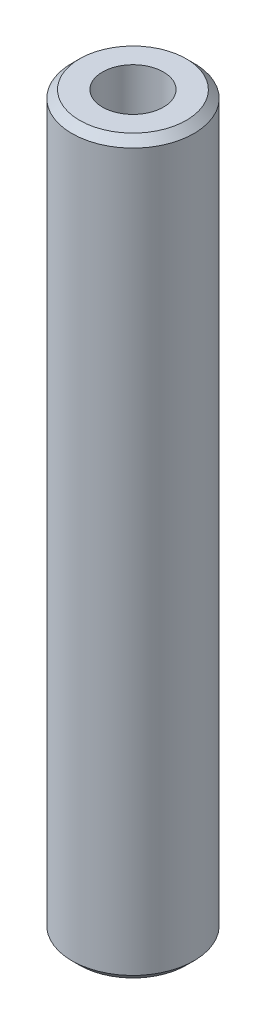
ISO-10303-21;
HEADER;
FILE_DESCRIPTION(('STEP AP214'),'2;1');
FILE_NAME('part.step','',(''),(''),'','','');
FILE_SCHEMA(('AUTOMOTIVE_DESIGN { 1 0 10303 214 1 1 1 1 }'));
ENDSEC;
DATA;
#1=APPLICATION_CONTEXT('core data for automotive mechanical design processes');
#2=APPLICATION_PROTOCOL_DEFINITION('international standard','automotive_design',2000,#1);
#3=PRODUCT_CONTEXT('',#1,'mechanical');
#4=PRODUCT('Part','Part','',(#3));
#5=PRODUCT_RELATED_PRODUCT_CATEGORY('part','',(#4));
#6=PRODUCT_DEFINITION_FORMATION('','',#4);
#7=PRODUCT_DEFINITION_CONTEXT('part definition',#1,'design');
#8=PRODUCT_DEFINITION('design','',#6,#7);
#9=PRODUCT_DEFINITION_SHAPE('','',#8);
#10=(LENGTH_UNIT() NAMED_UNIT(*) SI_UNIT(.MILLI.,.METRE.));
#11=(NAMED_UNIT(*) PLANE_ANGLE_UNIT() SI_UNIT($,.RADIAN.));
#12=(NAMED_UNIT(*) SI_UNIT($,.STERADIAN.) SOLID_ANGLE_UNIT());
#13=UNCERTAINTY_MEASURE_WITH_UNIT(LENGTH_MEASURE(1.E-05),#10,'distance_accuracy_value','');
#14=(GEOMETRIC_REPRESENTATION_CONTEXT(3) GLOBAL_UNCERTAINTY_ASSIGNED_CONTEXT((#13)) GLOBAL_UNIT_ASSIGNED_CONTEXT((#10,
#11,#12)) REPRESENTATION_CONTEXT('',''));
#15=CARTESIAN_POINT('',(0.,0.,0.));
#16=DIRECTION('',(0.,0.,1.));
#17=DIRECTION('',(1.,0.,0.));
#18=AXIS2_PLACEMENT_3D('',#15,#16,#17);
#19=CARTESIAN_POINT('',(0.,48.,0.));
#20=DIRECTION('',(0.,1.,0.));
#21=DIRECTION('',(0.,0.,1.));
#22=AXIS2_PLACEMENT_3D('',#19,#20,#21);
#23=PLANE('',#22);
#24=CARTESIAN_POINT('',(0.,48.,0.));
#25=DIRECTION('',(0.,1.,0.));
#26=DIRECTION('',(0.,0.,1.));
#27=AXIS2_PLACEMENT_3D('',#24,#25,#26);
#28=CIRCLE('',#27,3.5);
#29=CARTESIAN_POINT('',(0.,48.,3.5));
#30=VERTEX_POINT('',#29);
#31=EDGE_CURVE('E10',#30,#30,#28,.T.);
#32=ORIENTED_EDGE('',*,*,#31,.T.);
#33=EDGE_LOOP('',(#32));
#34=FACE_BOUND('',#33,.T.);
#35=CARTESIAN_POINT('',(0.,48.,0.));
#36=DIRECTION('',(0.,1.,0.));
#37=DIRECTION('',(0.,0.,1.));
#38=AXIS2_PLACEMENT_3D('',#35,#36,#37);
#39=CIRCLE('',#38,2.);
#40=CARTESIAN_POINT('',(0.,48.,2.));
#41=VERTEX_POINT('',#40);
#42=EDGE_CURVE('E70',#41,#41,#39,.T.);
#43=ORIENTED_EDGE('',*,*,#42,.F.);
#44=EDGE_LOOP('',(#43));
#45=FACE_BOUND('',#44,.T.);
#46=ADVANCED_FACE('F45',(#34,#45),#23,.T.);
#47=CARTESIAN_POINT('',(0.,0.,0.));
#48=DIRECTION('',(0.,1.,0.));
#49=DIRECTION('',(0.,0.,1.));
#50=AXIS2_PLACEMENT_3D('',#47,#48,#49);
#51=PLANE('',#50);
#52=CARTESIAN_POINT('',(0.,0.,0.));
#53=DIRECTION('',(0.,1.,0.));
#54=DIRECTION('',(0.,0.,1.));
#55=AXIS2_PLACEMENT_3D('',#52,#53,#54);
#56=CIRCLE('',#55,3.5);
#57=CARTESIAN_POINT('',(0.,0.,3.5));
#58=VERTEX_POINT('',#57);
#59=EDGE_CURVE('E54',#58,#58,#56,.F.);
#60=ORIENTED_EDGE('',*,*,#59,.T.);
#61=EDGE_LOOP('',(#60));
#62=FACE_BOUND('',#61,.T.);
#63=CARTESIAN_POINT('',(0.,0.,0.));
#64=DIRECTION('',(0.,1.,0.));
#65=DIRECTION('',(0.,0.,1.));
#66=AXIS2_PLACEMENT_3D('',#63,#64,#65);
#67=CIRCLE('',#66,2.);
#68=CARTESIAN_POINT('',(0.,0.,2.));
#69=VERTEX_POINT('',#68);
#70=EDGE_CURVE('E71',#69,#69,#67,.T.);
#71=ORIENTED_EDGE('',*,*,#70,.T.);
#72=EDGE_LOOP('',(#71));
#73=FACE_BOUND('',#72,.T.);
#74=ADVANCED_FACE('F83',(#62,#73),#51,.F.);
#75=CARTESIAN_POINT('',(0.,48.,0.));
#76=DIRECTION('',(0.,-1.,0.));
#77=DIRECTION('',(0.,0.,-1.));
#78=AXIS2_PLACEMENT_3D('',#75,#76,#77);
#79=CYLINDRICAL_SURFACE('',#78,4.);
#80=CARTESIAN_POINT('',(0.,0.5,0.));
#81=DIRECTION('',(0.,1.,0.));
#82=DIRECTION('',(0.,0.,1.));
#83=AXIS2_PLACEMENT_3D('',#80,#81,#82);
#84=CIRCLE('',#83,4.);
#85=CARTESIAN_POINT('',(0.,0.5,4.));
#86=VERTEX_POINT('',#85);
#87=EDGE_CURVE('E59',#86,#86,#84,.T.);
#88=ORIENTED_EDGE('',*,*,#87,.T.);
#89=EDGE_LOOP('',(#88));
#90=FACE_BOUND('',#89,.T.);
#91=CARTESIAN_POINT('',(0.,47.5,0.));
#92=DIRECTION('',(0.,1.,0.));
#93=DIRECTION('',(0.,0.,1.));
#94=AXIS2_PLACEMENT_3D('',#91,#92,#93);
#95=CIRCLE('',#94,4.);
#96=CARTESIAN_POINT('',(0.,47.5,4.));
#97=VERTEX_POINT('',#96);
#98=EDGE_CURVE('E64',#97,#97,#95,.F.);
#99=ORIENTED_EDGE('',*,*,#98,.T.);
#100=EDGE_LOOP('',(#99));
#101=FACE_BOUND('',#100,.T.);
#102=ADVANCED_FACE('F89',(#90,#101),#79,.T.);
#103=CARTESIAN_POINT('',(0.,48.,0.));
#104=DIRECTION('',(0.,-1.,0.));
#105=DIRECTION('',(0.,0.,-1.));
#106=AXIS2_PLACEMENT_3D('',#103,#104,#105);
#107=CYLINDRICAL_SURFACE('',#106,2.);
#108=ORIENTED_EDGE('',*,*,#42,.T.);
#109=EDGE_LOOP('',(#108));
#110=FACE_BOUND('',#109,.T.);
#111=ORIENTED_EDGE('',*,*,#70,.F.);
#112=EDGE_LOOP('',(#111));
#113=FACE_BOUND('',#112,.T.);
#114=ADVANCED_FACE('F79',(#110,#113),#107,.F.);
#115=CARTESIAN_POINT('',(0.,0.5,0.));
#116=DIRECTION('',(0.,1.,0.));
#117=DIRECTION('',(0.,0.,1.));
#118=AXIS2_PLACEMENT_3D('',#115,#116,#117);
#119=CONICAL_SURFACE('',#118,4.,0.785398163397445);
#120=ORIENTED_EDGE('',*,*,#59,.F.);
#121=EDGE_LOOP('',(#120));
#122=FACE_BOUND('',#121,.T.);
#123=ORIENTED_EDGE('',*,*,#87,.F.);
#124=EDGE_LOOP('',(#123));
#125=FACE_BOUND('',#124,.T.);
#126=ADVANCED_FACE('F96',(#122,#125),#119,.T.);
#127=CARTESIAN_POINT('',(0.,48.,0.));
#128=DIRECTION('',(0.,-1.,0.));
#129=DIRECTION('',(0.,0.,-1.));
#130=AXIS2_PLACEMENT_3D('',#127,#128,#129);
#131=CONICAL_SURFACE('',#130,3.5,0.785398163397438);
#132=ORIENTED_EDGE('',*,*,#98,.F.);
#133=EDGE_LOOP('',(#132));
#134=FACE_BOUND('',#133,.T.);
#135=ORIENTED_EDGE('',*,*,#31,.F.);
#136=EDGE_LOOP('',(#135));
#137=FACE_BOUND('',#136,.T.);
#138=ADVANCED_FACE('F48',(#134,#137),#131,.T.);
#139=CLOSED_SHELL('',(#46,#74,#102,#114,#126,#138));
#140=MANIFOLD_SOLID_BREP('B2',#139);
#141=ADVANCED_BREP_SHAPE_REPRESENTATION('',(#18,#140),#14);
#142=SHAPE_DEFINITION_REPRESENTATION(#9,#141);
ENDSEC;
END-ISO-10303-21;
